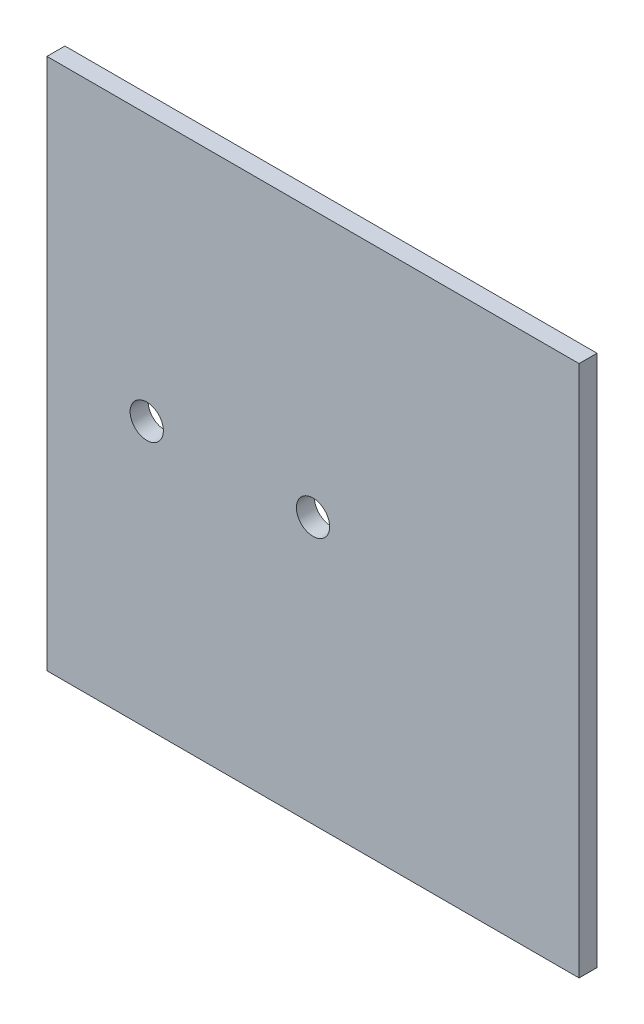
ISO-10303-21;
HEADER;
FILE_DESCRIPTION(('STEP AP214'),'2;1');
FILE_NAME('part.step','',(''),(''),'','','');
FILE_SCHEMA(('AUTOMOTIVE_DESIGN { 1 0 10303 214 1 1 1 1 }'));
ENDSEC;
DATA;
#1=APPLICATION_CONTEXT('core data for automotive mechanical design processes');
#2=APPLICATION_PROTOCOL_DEFINITION('international standard','automotive_design',2000,#1);
#3=PRODUCT_CONTEXT('',#1,'mechanical');
#4=PRODUCT('Part','Part','',(#3));
#5=PRODUCT_RELATED_PRODUCT_CATEGORY('part','',(#4));
#6=PRODUCT_DEFINITION_FORMATION('','',#4);
#7=PRODUCT_DEFINITION_CONTEXT('part definition',#1,'design');
#8=PRODUCT_DEFINITION('design','',#6,#7);
#9=PRODUCT_DEFINITION_SHAPE('','',#8);
#10=(LENGTH_UNIT() NAMED_UNIT(*) SI_UNIT(.MILLI.,.METRE.));
#11=(NAMED_UNIT(*) PLANE_ANGLE_UNIT() SI_UNIT($,.RADIAN.));
#12=(NAMED_UNIT(*) SI_UNIT($,.STERADIAN.) SOLID_ANGLE_UNIT());
#13=UNCERTAINTY_MEASURE_WITH_UNIT(LENGTH_MEASURE(1.E-05),#10,'distance_accuracy_value','');
#14=(GEOMETRIC_REPRESENTATION_CONTEXT(3) GLOBAL_UNCERTAINTY_ASSIGNED_CONTEXT((#13)) GLOBAL_UNIT_ASSIGNED_CONTEXT((#10,
#11,#12)) REPRESENTATION_CONTEXT('',''));
#15=CARTESIAN_POINT('',(0.,0.,0.));
#16=DIRECTION('',(0.,0.,1.));
#17=DIRECTION('',(1.,0.,0.));
#18=AXIS2_PLACEMENT_3D('',#15,#16,#17);
#19=CARTESIAN_POINT('',(-82.7,40.,-2.7));
#20=DIRECTION('',(-1.,0.,0.));
#21=DIRECTION('',(0.,0.,1.));
#22=AXIS2_PLACEMENT_3D('',#19,#20,#21);
#23=PLANE('',#22);
#24=DIRECTION('',(0.,-1.,0.));
#25=VECTOR('',#24,1.);
#26=CARTESIAN_POINT('',(-82.7,40.,0.));
#27=LINE('',#26,#25);
#28=CARTESIAN_POINT('',(-82.7,40.,0.));
#29=VERTEX_POINT('',#28);
#30=CARTESIAN_POINT('',(-82.7,-40.,0.));
#31=VERTEX_POINT('',#30);
#32=EDGE_CURVE('E98',#29,#31,#27,.T.);
#33=ORIENTED_EDGE('',*,*,#32,.F.);
#34=DIRECTION('',(0.,0.,1.));
#35=VECTOR('',#34,1.);
#36=CARTESIAN_POINT('',(-82.7,40.,-2.7));
#37=LINE('',#36,#35);
#38=CARTESIAN_POINT('',(-82.7,40.,-2.7));
#39=VERTEX_POINT('',#38);
#40=EDGE_CURVE('E11',#39,#29,#37,.T.);
#41=ORIENTED_EDGE('',*,*,#40,.F.);
#42=DIRECTION('',(0.,-1.,0.));
#43=VECTOR('',#42,1.);
#44=CARTESIAN_POINT('',(-82.7,40.,-2.7));
#45=LINE('',#44,#43);
#46=CARTESIAN_POINT('',(-82.7,-40.,-2.7));
#47=VERTEX_POINT('',#46);
#48=EDGE_CURVE('E91',#39,#47,#45,.T.);
#49=ORIENTED_EDGE('',*,*,#48,.T.);
#50=DIRECTION('',(0.,0.,1.));
#51=VECTOR('',#50,1.);
#52=CARTESIAN_POINT('',(-82.7,-40.,-2.7));
#53=LINE('',#52,#51);
#54=EDGE_CURVE('E36',#47,#31,#53,.T.);
#55=ORIENTED_EDGE('',*,*,#54,.T.);
#56=EDGE_LOOP('',(#33,#41,#49,#55));
#57=FACE_BOUND('',#56,.T.);
#58=ADVANCED_FACE('F33',(#57),#23,.T.);
#59=CARTESIAN_POINT('',(-82.7,40.,-2.7));
#60=DIRECTION('',(0.,1.,0.));
#61=DIRECTION('',(0.,0.,1.));
#62=AXIS2_PLACEMENT_3D('',#59,#60,#61);
#63=PLANE('',#62);
#64=DIRECTION('',(-1.,0.,0.));
#65=VECTOR('',#64,1.);
#66=CARTESIAN_POINT('',(-82.7,40.,0.));
#67=LINE('',#66,#65);
#68=CARTESIAN_POINT('',(-2.7,40.,0.));
#69=VERTEX_POINT('',#68);
#70=EDGE_CURVE('E93',#69,#29,#67,.T.);
#71=ORIENTED_EDGE('',*,*,#70,.F.);
#72=DIRECTION('',(0.,0.,1.));
#73=VECTOR('',#72,1.);
#74=CARTESIAN_POINT('',(-2.7,40.,-2.7));
#75=LINE('',#74,#73);
#76=CARTESIAN_POINT('',(-2.7,40.,-2.7));
#77=VERTEX_POINT('',#76);
#78=EDGE_CURVE('E42',#77,#69,#75,.T.);
#79=ORIENTED_EDGE('',*,*,#78,.F.);
#80=DIRECTION('',(-1.,0.,0.));
#81=VECTOR('',#80,1.);
#82=CARTESIAN_POINT('',(-82.7,40.,-2.7));
#83=LINE('',#82,#81);
#84=EDGE_CURVE('E88',#77,#39,#83,.T.);
#85=ORIENTED_EDGE('',*,*,#84,.T.);
#86=ORIENTED_EDGE('',*,*,#40,.T.);
#87=EDGE_LOOP('',(#71,#79,#85,#86));
#88=FACE_BOUND('',#87,.T.);
#89=ADVANCED_FACE('F109',(#88),#63,.T.);
#90=CARTESIAN_POINT('',(-2.7,40.,-2.7));
#91=DIRECTION('',(1.,0.,0.));
#92=DIRECTION('',(0.,0.,-1.));
#93=AXIS2_PLACEMENT_3D('',#90,#91,#92);
#94=PLANE('',#93);
#95=DIRECTION('',(0.,1.,0.));
#96=VECTOR('',#95,1.);
#97=CARTESIAN_POINT('',(-2.7,40.,0.));
#98=LINE('',#97,#96);
#99=CARTESIAN_POINT('',(-2.7,-40.,0.));
#100=VERTEX_POINT('',#99);
#101=EDGE_CURVE('E83',#100,#69,#98,.T.);
#102=ORIENTED_EDGE('',*,*,#101,.F.);
#103=DIRECTION('',(0.,0.,1.));
#104=VECTOR('',#103,1.);
#105=CARTESIAN_POINT('',(-2.7,-40.,-2.7));
#106=LINE('',#105,#104);
#107=CARTESIAN_POINT('',(-2.7,-40.,-2.7));
#108=VERTEX_POINT('',#107);
#109=EDGE_CURVE('E78',#108,#100,#106,.T.);
#110=ORIENTED_EDGE('',*,*,#109,.F.);
#111=DIRECTION('',(0.,1.,0.));
#112=VECTOR('',#111,1.);
#113=CARTESIAN_POINT('',(-2.7,40.,-2.7));
#114=LINE('',#113,#112);
#115=EDGE_CURVE('E81',#108,#77,#114,.T.);
#116=ORIENTED_EDGE('',*,*,#115,.T.);
#117=ORIENTED_EDGE('',*,*,#78,.T.);
#118=EDGE_LOOP('',(#102,#110,#116,#117));
#119=FACE_BOUND('',#118,.T.);
#120=ADVANCED_FACE('F80',(#119),#94,.T.);
#121=CARTESIAN_POINT('',(-82.7,-40.,-2.7));
#122=DIRECTION('',(0.,-1.,0.));
#123=DIRECTION('',(0.,0.,-1.));
#124=AXIS2_PLACEMENT_3D('',#121,#122,#123);
#125=PLANE('',#124);
#126=DIRECTION('',(1.,0.,0.));
#127=VECTOR('',#126,1.);
#128=CARTESIAN_POINT('',(-82.7,-40.,0.));
#129=LINE('',#128,#127);
#130=EDGE_CURVE('E101',#31,#100,#129,.T.);
#131=ORIENTED_EDGE('',*,*,#130,.F.);
#132=ORIENTED_EDGE('',*,*,#54,.F.);
#133=DIRECTION('',(1.,0.,0.));
#134=VECTOR('',#133,1.);
#135=CARTESIAN_POINT('',(-82.7,-40.,-2.7));
#136=LINE('',#135,#134);
#137=EDGE_CURVE('E87',#47,#108,#136,.T.);
#138=ORIENTED_EDGE('',*,*,#137,.T.);
#139=ORIENTED_EDGE('',*,*,#109,.T.);
#140=EDGE_LOOP('',(#131,#132,#138,#139));
#141=FACE_BOUND('',#140,.T.);
#142=ADVANCED_FACE('F90',(#141),#125,.T.);
#143=CARTESIAN_POINT('',(0.,0.,-2.7));
#144=DIRECTION('',(0.,0.,1.));
#145=DIRECTION('',(1.,0.,0.));
#146=AXIS2_PLACEMENT_3D('',#143,#144,#145);
#147=PLANE('',#146);
#148=CARTESIAN_POINT('',(-67.7,0.,-2.7));
#149=DIRECTION('',(0.,0.,-1.));
#150=DIRECTION('',(-1.,0.,0.));
#151=AXIS2_PLACEMENT_3D('',#148,#149,#150);
#152=CIRCLE('',#151,2.49999999999999);
#153=CARTESIAN_POINT('',(-70.2,0.,-2.7));
#154=VERTEX_POINT('',#153);
#155=EDGE_CURVE('E144',#154,#154,#152,.T.);
#156=ORIENTED_EDGE('',*,*,#155,.F.);
#157=EDGE_LOOP('',(#156));
#158=FACE_BOUND('',#157,.T.);
#159=CARTESIAN_POINT('',(-42.7,0.,-2.7));
#160=DIRECTION('',(0.,0.,-1.));
#161=DIRECTION('',(-1.,0.,0.));
#162=AXIS2_PLACEMENT_3D('',#159,#160,#161);
#163=CIRCLE('',#162,2.5);
#164=CARTESIAN_POINT('',(-45.2,0.,-2.7));
#165=VERTEX_POINT('',#164);
#166=EDGE_CURVE('E149',#165,#165,#163,.T.);
#167=ORIENTED_EDGE('',*,*,#166,.F.);
#168=EDGE_LOOP('',(#167));
#169=FACE_BOUND('',#168,.T.);
#170=ORIENTED_EDGE('',*,*,#48,.F.);
#171=ORIENTED_EDGE('',*,*,#84,.F.);
#172=ORIENTED_EDGE('',*,*,#115,.F.);
#173=ORIENTED_EDGE('',*,*,#137,.F.);
#174=EDGE_LOOP('',(#170,#171,#172,#173));
#175=FACE_BOUND('',#174,.T.);
#176=ADVANCED_FACE('F86',(#158,#169,#175),#147,.F.);
#177=CARTESIAN_POINT('',(0.,0.,0.));
#178=DIRECTION('',(0.,0.,1.));
#179=DIRECTION('',(1.,0.,0.));
#180=AXIS2_PLACEMENT_3D('',#177,#178,#179);
#181=PLANE('',#180);
#182=CARTESIAN_POINT('',(-67.7,0.,0.));
#183=DIRECTION('',(0.,0.,-1.));
#184=DIRECTION('',(-1.,0.,0.));
#185=AXIS2_PLACEMENT_3D('',#182,#183,#184);
#186=CIRCLE('',#185,2.49999999999999);
#187=CARTESIAN_POINT('',(-70.2,0.,0.));
#188=VERTEX_POINT('',#187);
#189=EDGE_CURVE('E102',#188,#188,#186,.T.);
#190=ORIENTED_EDGE('',*,*,#189,.T.);
#191=EDGE_LOOP('',(#190));
#192=FACE_BOUND('',#191,.T.);
#193=CARTESIAN_POINT('',(-42.7,0.,0.));
#194=DIRECTION('',(0.,0.,-1.));
#195=DIRECTION('',(-1.,0.,0.));
#196=AXIS2_PLACEMENT_3D('',#193,#194,#195);
#197=CIRCLE('',#196,2.5);
#198=CARTESIAN_POINT('',(-45.2,0.,0.));
#199=VERTEX_POINT('',#198);
#200=EDGE_CURVE('E145',#199,#199,#197,.T.);
#201=ORIENTED_EDGE('',*,*,#200,.T.);
#202=EDGE_LOOP('',(#201));
#203=FACE_BOUND('',#202,.T.);
#204=ORIENTED_EDGE('',*,*,#32,.T.);
#205=ORIENTED_EDGE('',*,*,#130,.T.);
#206=ORIENTED_EDGE('',*,*,#101,.T.);
#207=ORIENTED_EDGE('',*,*,#70,.T.);
#208=EDGE_LOOP('',(#204,#205,#206,#207));
#209=FACE_BOUND('',#208,.T.);
#210=ADVANCED_FACE('F108',(#192,#203,#209),#181,.T.);
#211=CARTESIAN_POINT('',(-42.7,0.,0.));
#212=DIRECTION('',(0.,0.,-1.));
#213=DIRECTION('',(-1.,0.,0.));
#214=AXIS2_PLACEMENT_3D('',#211,#212,#213);
#215=CYLINDRICAL_SURFACE('',#214,2.5);
#216=CARTESIAN_POINT('',(-45.2,0.,0.));
#217=CARTESIAN_POINT('',(-45.2,0.,-0.028125));
#218=CARTESIAN_POINT('',(-45.2,0.,-0.05625));
#219=CARTESIAN_POINT('',(-45.2,0.,-0.1125));
#220=CARTESIAN_POINT('',(-45.2,0.,-0.140625));
#221=CARTESIAN_POINT('',(-45.2,0.,-0.196875));
#222=CARTESIAN_POINT('',(-45.2,0.,-0.225));
#223=CARTESIAN_POINT('',(-45.2,0.,-0.28125));
#224=CARTESIAN_POINT('',(-45.2,0.,-0.309375));
#225=CARTESIAN_POINT('',(-45.2,0.,-0.365625));
#226=CARTESIAN_POINT('',(-45.2,0.,-0.39375));
#227=CARTESIAN_POINT('',(-45.2,0.,-0.45));
#228=CARTESIAN_POINT('',(-45.2,0.,-0.478125));
#229=CARTESIAN_POINT('',(-45.2,0.,-0.534375));
#230=CARTESIAN_POINT('',(-45.2,0.,-0.5625));
#231=CARTESIAN_POINT('',(-45.2,0.,-0.61875));
#232=CARTESIAN_POINT('',(-45.2,0.,-0.646875));
#233=CARTESIAN_POINT('',(-45.2,0.,-0.703125));
#234=CARTESIAN_POINT('',(-45.2,0.,-0.73125));
#235=CARTESIAN_POINT('',(-45.2,0.,-0.7875));
#236=CARTESIAN_POINT('',(-45.2,0.,-0.815625));
#237=CARTESIAN_POINT('',(-45.2,0.,-0.871875));
#238=CARTESIAN_POINT('',(-45.2,0.,-0.9));
#239=CARTESIAN_POINT('',(-45.2,0.,-0.95625));
#240=CARTESIAN_POINT('',(-45.2,0.,-0.984375));
#241=CARTESIAN_POINT('',(-45.2,0.,-1.040625));
#242=CARTESIAN_POINT('',(-45.2,0.,-1.06875));
#243=CARTESIAN_POINT('',(-45.2,0.,-1.125));
#244=CARTESIAN_POINT('',(-45.2,0.,-1.153125));
#245=CARTESIAN_POINT('',(-45.2,0.,-1.209375));
#246=CARTESIAN_POINT('',(-45.2,0.,-1.2375));
#247=CARTESIAN_POINT('',(-45.2,0.,-1.29375));
#248=CARTESIAN_POINT('',(-45.2,0.,-1.321875));
#249=CARTESIAN_POINT('',(-45.2,0.,-1.378125));
#250=CARTESIAN_POINT('',(-45.2,0.,-1.40625));
#251=CARTESIAN_POINT('',(-45.2,0.,-1.4625));
#252=CARTESIAN_POINT('',(-45.2,0.,-1.490625));
#253=CARTESIAN_POINT('',(-45.2,0.,-1.546875));
#254=CARTESIAN_POINT('',(-45.2,0.,-1.575));
#255=CARTESIAN_POINT('',(-45.2,0.,-1.63125));
#256=CARTESIAN_POINT('',(-45.2,0.,-1.659375));
#257=CARTESIAN_POINT('',(-45.2,0.,-1.715625));
#258=CARTESIAN_POINT('',(-45.2,0.,-1.74375));
#259=CARTESIAN_POINT('',(-45.2,0.,-1.8));
#260=CARTESIAN_POINT('',(-45.2,0.,-1.828125));
#261=CARTESIAN_POINT('',(-45.2,0.,-1.884375));
#262=CARTESIAN_POINT('',(-45.2,0.,-1.9125));
#263=CARTESIAN_POINT('',(-45.2,0.,-1.96875));
#264=CARTESIAN_POINT('',(-45.2,0.,-1.996875));
#265=CARTESIAN_POINT('',(-45.2,0.,-2.053125));
#266=CARTESIAN_POINT('',(-45.2,0.,-2.08125));
#267=CARTESIAN_POINT('',(-45.2,0.,-2.1375));
#268=CARTESIAN_POINT('',(-45.2,0.,-2.165625));
#269=CARTESIAN_POINT('',(-45.2,0.,-2.221875));
#270=CARTESIAN_POINT('',(-45.2,0.,-2.25));
#271=CARTESIAN_POINT('',(-45.2,0.,-2.30625));
#272=CARTESIAN_POINT('',(-45.2,0.,-2.334375));
#273=CARTESIAN_POINT('',(-45.2,0.,-2.390625));
#274=CARTESIAN_POINT('',(-45.2,0.,-2.41875));
#275=CARTESIAN_POINT('',(-45.2,0.,-2.475));
#276=CARTESIAN_POINT('',(-45.2,0.,-2.503125));
#277=CARTESIAN_POINT('',(-45.2,0.,-2.559375));
#278=CARTESIAN_POINT('',(-45.2,0.,-2.5875));
#279=CARTESIAN_POINT('',(-45.2,0.,-2.64375));
#280=CARTESIAN_POINT('',(-45.2,0.,-2.671875));
#281=CARTESIAN_POINT('',(-45.2,0.,-2.7));
#282=B_SPLINE_CURVE_WITH_KNOTS('',3,(#216,#217,#218,#219,#220,#221,#222,#223,#224,#225,#226,
#227,#228,#229,#230,#231,#232,#233,#234,#235,#236,#237,#238,#239,#240,#241,#242,#243,#244,#245,
#246,#247,#248,#249,#250,#251,#252,#253,#254,#255,#256,#257,#258,#259,#260,#261,#262,#263,#264,
#265,#266,#267,#268,#269,#270,#271,#272,#273,#274,#275,#276,#277,#278,#279,#280,#281),
.UNSPECIFIED.,.F.,.F.,(4,2,2,2,2,2,2,2,2,2,2,2,2,2,2,2,2,2,2,2,2,2,2,2,2,2,2,2,2,2,2,2,4),(0.,
0.084375,0.16875,0.253125,0.3375,0.421875,0.50625,0.590625,0.675,0.759375,0.84375,0.928125,
1.0125,1.096875,1.18125,1.265625,1.35,1.434375,1.51875,1.603125,1.6875,1.771875,1.85625,
1.940625,2.025,2.109375,2.19375,2.278125,2.3625,2.446875,2.53125,2.615625,2.7),.UNSPECIFIED.);
#283=EDGE_CURVE('BSEAM127',#199,#165,#282,.T.);
#284=ORIENTED_EDGE('',*,*,#200,.F.);
#285=ORIENTED_EDGE('',*,*,#166,.T.);
#286=ORIENTED_EDGE('',*,*,#283,.T.);
#287=ORIENTED_EDGE('',*,*,#283,.F.);
#288=EDGE_LOOP('',(#284,#286,#285,#287));
#289=FACE_BOUND('',#288,.T.);
#290=ADVANCED_FACE('F127',(#289),#215,.F.);
#291=CARTESIAN_POINT('',(-67.7,0.,0.));
#292=DIRECTION('',(0.,0.,-1.));
#293=DIRECTION('',(-1.,0.,0.));
#294=AXIS2_PLACEMENT_3D('',#291,#292,#293);
#295=CYLINDRICAL_SURFACE('',#294,2.49999999999999);
#296=CARTESIAN_POINT('',(-70.2,0.,0.));
#297=CARTESIAN_POINT('',(-70.2,0.,-0.028125));
#298=CARTESIAN_POINT('',(-70.2,0.,-0.05625));
#299=CARTESIAN_POINT('',(-70.2,0.,-0.1125));
#300=CARTESIAN_POINT('',(-70.2,0.,-0.140625));
#301=CARTESIAN_POINT('',(-70.2,0.,-0.196875));
#302=CARTESIAN_POINT('',(-70.2,0.,-0.225));
#303=CARTESIAN_POINT('',(-70.2,0.,-0.28125));
#304=CARTESIAN_POINT('',(-70.2,0.,-0.309375));
#305=CARTESIAN_POINT('',(-70.2,0.,-0.365625));
#306=CARTESIAN_POINT('',(-70.2,0.,-0.39375));
#307=CARTESIAN_POINT('',(-70.2,0.,-0.45));
#308=CARTESIAN_POINT('',(-70.2,0.,-0.478125));
#309=CARTESIAN_POINT('',(-70.2,0.,-0.534375));
#310=CARTESIAN_POINT('',(-70.2,0.,-0.5625));
#311=CARTESIAN_POINT('',(-70.2,0.,-0.61875));
#312=CARTESIAN_POINT('',(-70.2,0.,-0.646875));
#313=CARTESIAN_POINT('',(-70.2,0.,-0.703125));
#314=CARTESIAN_POINT('',(-70.2,0.,-0.73125));
#315=CARTESIAN_POINT('',(-70.2,0.,-0.7875));
#316=CARTESIAN_POINT('',(-70.2,0.,-0.815625));
#317=CARTESIAN_POINT('',(-70.2,0.,-0.871875));
#318=CARTESIAN_POINT('',(-70.2,0.,-0.9));
#319=CARTESIAN_POINT('',(-70.2,0.,-0.95625));
#320=CARTESIAN_POINT('',(-70.2,0.,-0.984375));
#321=CARTESIAN_POINT('',(-70.2,0.,-1.040625));
#322=CARTESIAN_POINT('',(-70.2,0.,-1.06875));
#323=CARTESIAN_POINT('',(-70.2,0.,-1.125));
#324=CARTESIAN_POINT('',(-70.2,0.,-1.153125));
#325=CARTESIAN_POINT('',(-70.2,0.,-1.209375));
#326=CARTESIAN_POINT('',(-70.2,0.,-1.2375));
#327=CARTESIAN_POINT('',(-70.2,0.,-1.29375));
#328=CARTESIAN_POINT('',(-70.2,0.,-1.321875));
#329=CARTESIAN_POINT('',(-70.2,0.,-1.378125));
#330=CARTESIAN_POINT('',(-70.2,0.,-1.40625));
#331=CARTESIAN_POINT('',(-70.2,0.,-1.4625));
#332=CARTESIAN_POINT('',(-70.2,0.,-1.490625));
#333=CARTESIAN_POINT('',(-70.2,0.,-1.546875));
#334=CARTESIAN_POINT('',(-70.2,0.,-1.575));
#335=CARTESIAN_POINT('',(-70.2,0.,-1.63125));
#336=CARTESIAN_POINT('',(-70.2,0.,-1.659375));
#337=CARTESIAN_POINT('',(-70.2,0.,-1.715625));
#338=CARTESIAN_POINT('',(-70.2,0.,-1.74375));
#339=CARTESIAN_POINT('',(-70.2,0.,-1.8));
#340=CARTESIAN_POINT('',(-70.2,0.,-1.828125));
#341=CARTESIAN_POINT('',(-70.2,0.,-1.884375));
#342=CARTESIAN_POINT('',(-70.2,0.,-1.9125));
#343=CARTESIAN_POINT('',(-70.2,0.,-1.96875));
#344=CARTESIAN_POINT('',(-70.2,0.,-1.996875));
#345=CARTESIAN_POINT('',(-70.2,0.,-2.053125));
#346=CARTESIAN_POINT('',(-70.2,0.,-2.08125));
#347=CARTESIAN_POINT('',(-70.2,0.,-2.1375));
#348=CARTESIAN_POINT('',(-70.2,0.,-2.165625));
#349=CARTESIAN_POINT('',(-70.2,0.,-2.221875));
#350=CARTESIAN_POINT('',(-70.2,0.,-2.25));
#351=CARTESIAN_POINT('',(-70.2,0.,-2.30625));
#352=CARTESIAN_POINT('',(-70.2,0.,-2.334375));
#353=CARTESIAN_POINT('',(-70.2,0.,-2.390625));
#354=CARTESIAN_POINT('',(-70.2,0.,-2.41875));
#355=CARTESIAN_POINT('',(-70.2,0.,-2.475));
#356=CARTESIAN_POINT('',(-70.2,0.,-2.503125));
#357=CARTESIAN_POINT('',(-70.2,0.,-2.559375));
#358=CARTESIAN_POINT('',(-70.2,0.,-2.5875));
#359=CARTESIAN_POINT('',(-70.2,0.,-2.64375));
#360=CARTESIAN_POINT('',(-70.2,0.,-2.671875));
#361=CARTESIAN_POINT('',(-70.2,0.,-2.7));
#362=B_SPLINE_CURVE_WITH_KNOTS('',3,(#296,#297,#298,#299,#300,#301,#302,#303,#304,#305,#306,
#307,#308,#309,#310,#311,#312,#313,#314,#315,#316,#317,#318,#319,#320,#321,#322,#323,#324,#325,
#326,#327,#328,#329,#330,#331,#332,#333,#334,#335,#336,#337,#338,#339,#340,#341,#342,#343,#344,
#345,#346,#347,#348,#349,#350,#351,#352,#353,#354,#355,#356,#357,#358,#359,#360,#361),
.UNSPECIFIED.,.F.,.F.,(4,2,2,2,2,2,2,2,2,2,2,2,2,2,2,2,2,2,2,2,2,2,2,2,2,2,2,2,2,2,2,2,4),(0.,
0.084375,0.16875,0.253125,0.3375,0.421875,0.50625,0.590625,0.675,0.759375,0.84375,0.928125,
1.0125,1.096875,1.18125,1.265625,1.35,1.434375,1.51875,1.603125,1.6875,1.771875,1.85625,
1.940625,2.025,2.109375,2.19375,2.278125,2.3625,2.446875,2.53125,2.615625,2.7),.UNSPECIFIED.);
#363=EDGE_CURVE('BSEAM134',#188,#154,#362,.T.);
#364=ORIENTED_EDGE('',*,*,#189,.F.);
#365=ORIENTED_EDGE('',*,*,#155,.T.);
#366=ORIENTED_EDGE('',*,*,#363,.T.);
#367=ORIENTED_EDGE('',*,*,#363,.F.);
#368=EDGE_LOOP('',(#364,#366,#365,#367));
#369=FACE_BOUND('',#368,.T.);
#370=ADVANCED_FACE('F134',(#369),#295,.F.);
#371=CLOSED_SHELL('',(#58,#89,#120,#142,#176,#210,#290,#370));
#372=MANIFOLD_SOLID_BREP('B2',#371);
#373=ADVANCED_BREP_SHAPE_REPRESENTATION('',(#18,#372),#14);
#374=SHAPE_DEFINITION_REPRESENTATION(#9,#373);
ENDSEC;
END-ISO-10303-21;
